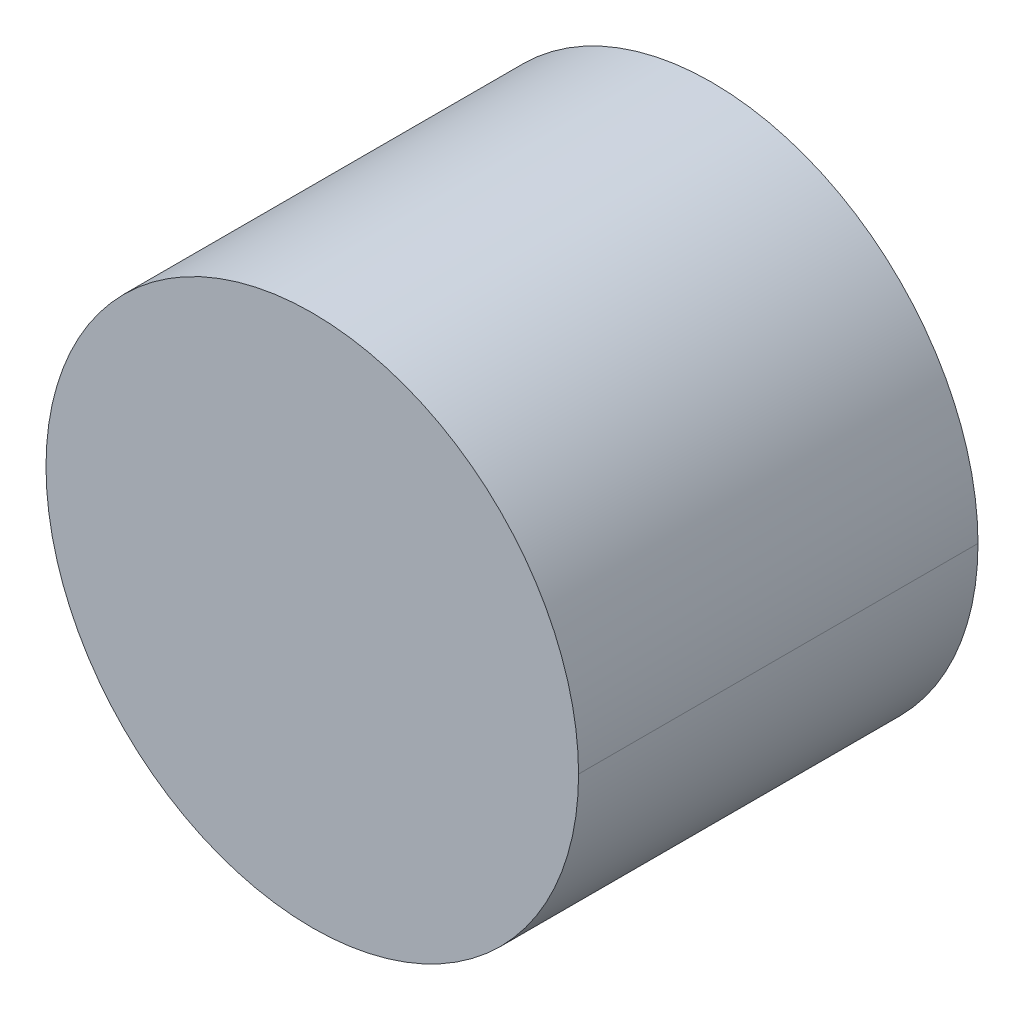
ISO-10303-21;
HEADER;
FILE_DESCRIPTION(('STEP AP214'),'2;1');
FILE_NAME('part.step','',(''),(''),'','','');
FILE_SCHEMA(('AUTOMOTIVE_DESIGN { 1 0 10303 214 1 1 1 1 }'));
ENDSEC;
DATA;
#1=APPLICATION_CONTEXT('core data for automotive mechanical design processes');
#2=APPLICATION_PROTOCOL_DEFINITION('international standard','automotive_design',2000,#1);
#3=PRODUCT_CONTEXT('',#1,'mechanical');
#4=PRODUCT('Part','Part','',(#3));
#5=PRODUCT_RELATED_PRODUCT_CATEGORY('part','',(#4));
#6=PRODUCT_DEFINITION_FORMATION('','',#4);
#7=PRODUCT_DEFINITION_CONTEXT('part definition',#1,'design');
#8=PRODUCT_DEFINITION('design','',#6,#7);
#9=PRODUCT_DEFINITION_SHAPE('','',#8);
#10=(LENGTH_UNIT() NAMED_UNIT(*) SI_UNIT(.MILLI.,.METRE.));
#11=(NAMED_UNIT(*) PLANE_ANGLE_UNIT() SI_UNIT($,.RADIAN.));
#12=(NAMED_UNIT(*) SI_UNIT($,.STERADIAN.) SOLID_ANGLE_UNIT());
#13=UNCERTAINTY_MEASURE_WITH_UNIT(LENGTH_MEASURE(1.E-05),#10,'distance_accuracy_value','');
#14=(GEOMETRIC_REPRESENTATION_CONTEXT(3) GLOBAL_UNCERTAINTY_ASSIGNED_CONTEXT((#13)) GLOBAL_UNIT_ASSIGNED_CONTEXT((#10,
#11,#12)) REPRESENTATION_CONTEXT('',''));
#15=CARTESIAN_POINT('',(0.,0.,0.));
#16=DIRECTION('',(0.,0.,1.));
#17=DIRECTION('',(1.,0.,0.));
#18=AXIS2_PLACEMENT_3D('',#15,#16,#17);
#19=CARTESIAN_POINT('',(0.,0.,16.9903914571));
#20=DIRECTION('',(0.,0.,-1.));
#21=DIRECTION('',(0.,-1.,0.));
#22=AXIS2_PLACEMENT_3D('',#19,#20,#21);
#23=PLANE('',#22);
#24=CARTESIAN_POINT('',(48.,0.,16.9903914571));
#25=DIRECTION('',(0.,0.,-1.));
#26=DIRECTION('',(1.,0.,0.));
#27=AXIS2_PLACEMENT_3D('',#24,#25,#26);
#28=CIRCLE('',#27,1.75);
#29=CARTESIAN_POINT('',(49.75,0.,16.9903914571));
#30=VERTEX_POINT('',#29);
#31=CARTESIAN_POINT('',(46.25,0.,16.9903914571));
#32=VERTEX_POINT('',#31);
#33=EDGE_CURVE('E27',#30,#32,#28,.T.);
#34=ORIENTED_EDGE('',*,*,#33,.T.);
#35=CARTESIAN_POINT('',(48.,0.,16.9903914571));
#36=DIRECTION('',(0.,0.,-1.));
#37=DIRECTION('',(1.,0.,0.));
#38=AXIS2_PLACEMENT_3D('',#35,#36,#37);
#39=CIRCLE('',#38,1.75);
#40=EDGE_CURVE('E11',#32,#30,#39,.T.);
#41=ORIENTED_EDGE('',*,*,#40,.T.);
#42=EDGE_LOOP('',(#34,#41));
#43=FACE_BOUND('',#42,.T.);
#44=ADVANCED_FACE('F16',(#43),#23,.T.);
#45=CARTESIAN_POINT('',(48.,0.,14.2403914571));
#46=DIRECTION('',(0.,0.,-1.));
#47=DIRECTION('',(1.,0.,0.));
#48=AXIS2_PLACEMENT_3D('',#45,#46,#47);
#49=CYLINDRICAL_SURFACE('',#48,1.75);
#50=DIRECTION('',(0.,0.,1.));
#51=VECTOR('',#50,1.);
#52=CARTESIAN_POINT('',(46.25,0.,14.2403914571));
#53=LINE('',#52,#51);
#54=CARTESIAN_POINT('',(46.25,0.,11.4903914571));
#55=VERTEX_POINT('',#54);
#56=EDGE_CURVE('E96',#55,#32,#53,.T.);
#57=ORIENTED_EDGE('',*,*,#56,.F.);
#58=CARTESIAN_POINT('',(48.,0.,11.4903914571));
#59=DIRECTION('',(0.,0.,-1.));
#60=DIRECTION('',(1.,0.,0.));
#61=AXIS2_PLACEMENT_3D('',#58,#59,#60);
#62=CIRCLE('',#61,1.75);
#63=CARTESIAN_POINT('',(49.75,0.,11.4903914571));
#64=VERTEX_POINT('',#63);
#65=EDGE_CURVE('E101',#55,#64,#62,.T.);
#66=ORIENTED_EDGE('',*,*,#65,.T.);
#67=DIRECTION('',(0.,0.,1.));
#68=VECTOR('',#67,1.);
#69=CARTESIAN_POINT('',(49.75,0.,14.2403914571));
#70=LINE('',#69,#68);
#71=EDGE_CURVE('E88',#64,#30,#70,.T.);
#72=ORIENTED_EDGE('',*,*,#71,.T.);
#73=ORIENTED_EDGE('',*,*,#40,.F.);
#74=EDGE_LOOP('',(#57,#66,#72,#73));
#75=FACE_BOUND('',#74,.T.);
#76=ADVANCED_FACE('F105',(#75),#49,.F.);
#77=CARTESIAN_POINT('',(48.,0.,14.2403914571));
#78=DIRECTION('',(0.,0.,-1.));
#79=DIRECTION('',(1.,0.,0.));
#80=AXIS2_PLACEMENT_3D('',#77,#78,#79);
#81=CYLINDRICAL_SURFACE('',#80,1.75);
#82=ORIENTED_EDGE('',*,*,#71,.F.);
#83=CARTESIAN_POINT('',(48.,0.,11.4903914571));
#84=DIRECTION('',(0.,0.,-1.));
#85=DIRECTION('',(1.,0.,0.));
#86=AXIS2_PLACEMENT_3D('',#83,#84,#85);
#87=CIRCLE('',#86,1.75);
#88=EDGE_CURVE('E92',#64,#55,#87,.T.);
#89=ORIENTED_EDGE('',*,*,#88,.T.);
#90=ORIENTED_EDGE('',*,*,#56,.T.);
#91=ORIENTED_EDGE('',*,*,#33,.F.);
#92=EDGE_LOOP('',(#82,#89,#90,#91));
#93=FACE_BOUND('',#92,.T.);
#94=ADVANCED_FACE('F90',(#93),#81,.F.);
#95=CARTESIAN_POINT('',(0.,0.,16.9903914571));
#96=DIRECTION('',(0.,0.,-1.));
#97=DIRECTION('',(0.,-1.,0.));
#98=AXIS2_PLACEMENT_3D('',#95,#96,#97);
#99=PLANE('',#98);
#100=CARTESIAN_POINT('',(-48.,0.,16.9903914571));
#101=DIRECTION('',(0.,0.,-1.));
#102=DIRECTION('',(1.,0.,0.));
#103=AXIS2_PLACEMENT_3D('',#100,#101,#102);
#104=CIRCLE('',#103,1.75);
#105=CARTESIAN_POINT('',(-49.75,0.,16.9903914571));
#106=VERTEX_POINT('',#105);
#107=CARTESIAN_POINT('',(-46.25,0.,16.9903914571));
#108=VERTEX_POINT('',#107);
#109=EDGE_CURVE('E122',#106,#108,#104,.T.);
#110=ORIENTED_EDGE('',*,*,#109,.T.);
#111=CARTESIAN_POINT('',(-48.,0.,16.9903914571));
#112=DIRECTION('',(0.,0.,-1.));
#113=DIRECTION('',(1.,0.,0.));
#114=AXIS2_PLACEMENT_3D('',#111,#112,#113);
#115=CIRCLE('',#114,1.75);
#116=EDGE_CURVE('E97',#108,#106,#115,.T.);
#117=ORIENTED_EDGE('',*,*,#116,.T.);
#118=EDGE_LOOP('',(#110,#117));
#119=FACE_BOUND('',#118,.T.);
#120=ADVANCED_FACE('F236',(#119),#99,.T.);
#121=CARTESIAN_POINT('',(-48.,0.,14.2403914571));
#122=DIRECTION('',(0.,0.,-1.));
#123=DIRECTION('',(-1.,0.,0.));
#124=AXIS2_PLACEMENT_3D('',#121,#122,#123);
#125=CYLINDRICAL_SURFACE('',#124,1.75);
#126=DIRECTION('',(0.,0.,1.));
#127=VECTOR('',#126,1.);
#128=CARTESIAN_POINT('',(-46.25,0.,14.2403914571));
#129=LINE('',#128,#127);
#130=CARTESIAN_POINT('',(-46.25,0.,11.4903914571));
#131=VERTEX_POINT('',#130);
#132=EDGE_CURVE('E119',#131,#108,#129,.T.);
#133=ORIENTED_EDGE('',*,*,#132,.F.);
#134=CARTESIAN_POINT('',(-48.,0.,11.4903914571));
#135=DIRECTION('',(0.,0.,-1.));
#136=DIRECTION('',(1.,0.,0.));
#137=AXIS2_PLACEMENT_3D('',#134,#135,#136);
#138=CIRCLE('',#137,1.75);
#139=CARTESIAN_POINT('',(-49.75,0.,11.4903914571));
#140=VERTEX_POINT('',#139);
#141=EDGE_CURVE('E103',#131,#140,#138,.T.);
#142=ORIENTED_EDGE('',*,*,#141,.T.);
#143=DIRECTION('',(0.,0.,1.));
#144=VECTOR('',#143,1.);
#145=CARTESIAN_POINT('',(-49.75,0.,14.2403914571));
#146=LINE('',#145,#144);
#147=EDGE_CURVE('E116',#140,#106,#146,.T.);
#148=ORIENTED_EDGE('',*,*,#147,.T.);
#149=ORIENTED_EDGE('',*,*,#116,.F.);
#150=EDGE_LOOP('',(#133,#142,#148,#149));
#151=FACE_BOUND('',#150,.T.);
#152=ADVANCED_FACE('F230',(#151),#125,.F.);
#153=CARTESIAN_POINT('',(-48.,0.,14.2403914571));
#154=DIRECTION('',(0.,0.,-1.));
#155=DIRECTION('',(-1.,0.,0.));
#156=AXIS2_PLACEMENT_3D('',#153,#154,#155);
#157=CYLINDRICAL_SURFACE('',#156,1.75);
#158=ORIENTED_EDGE('',*,*,#147,.F.);
#159=CARTESIAN_POINT('',(-48.,0.,11.4903914571));
#160=DIRECTION('',(0.,0.,-1.));
#161=DIRECTION('',(1.,0.,0.));
#162=AXIS2_PLACEMENT_3D('',#159,#160,#161);
#163=CIRCLE('',#162,1.75);
#164=EDGE_CURVE('E120',#140,#131,#163,.T.);
#165=ORIENTED_EDGE('',*,*,#164,.T.);
#166=ORIENTED_EDGE('',*,*,#132,.T.);
#167=ORIENTED_EDGE('',*,*,#109,.F.);
#168=EDGE_LOOP('',(#158,#165,#166,#167));
#169=FACE_BOUND('',#168,.T.);
#170=ADVANCED_FACE('F225',(#169),#157,.F.);
#171=CARTESIAN_POINT('',(0.,0.,11.4903914571));
#172=DIRECTION('',(0.,0.,1.));
#173=DIRECTION('',(1.,0.,0.));
#174=AXIS2_PLACEMENT_3D('',#171,#172,#173);
#175=PLANE('',#174);
#176=ORIENTED_EDGE('',*,*,#141,.F.);
#177=ORIENTED_EDGE('',*,*,#164,.F.);
#178=EDGE_LOOP('',(#176,#177));
#179=FACE_BOUND('',#178,.T.);
#180=ORIENTED_EDGE('',*,*,#65,.F.);
#181=ORIENTED_EDGE('',*,*,#88,.F.);
#182=EDGE_LOOP('',(#180,#181));
#183=FACE_BOUND('',#182,.T.);
#184=CARTESIAN_POINT('',(0.,0.,11.4903914571));
#185=DIRECTION('',(0.,0.,1.));
#186=DIRECTION('',(1.,0.,0.));
#187=AXIS2_PLACEMENT_3D('',#184,#185,#186);
#188=CIRCLE('',#187,4.188);
#189=CARTESIAN_POINT('',(-3.6753157692,-2.00783415567,11.4903914571));
#190=VERTEX_POINT('',#189);
#191=CARTESIAN_POINT('',(3.6753157692,2.00783415567,11.4903914571));
#192=VERTEX_POINT('',#191);
#193=EDGE_CURVE('E151',#190,#192,#188,.T.);
#194=ORIENTED_EDGE('',*,*,#193,.T.);
#195=CARTESIAN_POINT('',(0.,0.,11.4903914571));
#196=DIRECTION('',(0.,0.,1.));
#197=DIRECTION('',(1.,0.,0.));
#198=AXIS2_PLACEMENT_3D('',#195,#196,#197);
#199=CIRCLE('',#198,4.188);
#200=EDGE_CURVE('E20',#192,#190,#199,.T.);
#201=ORIENTED_EDGE('',*,*,#200,.T.);
#202=EDGE_LOOP('',(#194,#201));
#203=FACE_BOUND('',#202,.T.);
#204=CARTESIAN_POINT('',(0.,0.,11.4903914571));
#205=DIRECTION('',(0.,0.,1.));
#206=DIRECTION('',(1.,0.,0.));
#207=AXIS2_PLACEMENT_3D('',#204,#205,#206);
#208=CIRCLE('',#207,54.);
#209=CARTESIAN_POINT('',(-54.,0.,11.4903914571));
#210=VERTEX_POINT('',#209);
#211=CARTESIAN_POINT('',(54.,0.,11.4903914571));
#212=VERTEX_POINT('',#211);
#213=EDGE_CURVE('E156',#210,#212,#208,.T.);
#214=ORIENTED_EDGE('',*,*,#213,.F.);
#215=CARTESIAN_POINT('',(0.,0.,11.4903914571));
#216=DIRECTION('',(0.,0.,1.));
#217=DIRECTION('',(1.,0.,0.));
#218=AXIS2_PLACEMENT_3D('',#215,#216,#217);
#219=CIRCLE('',#218,54.);
#220=EDGE_CURVE('E114',#212,#210,#219,.T.);
#221=ORIENTED_EDGE('',*,*,#220,.F.);
#222=EDGE_LOOP('',(#214,#221));
#223=FACE_BOUND('',#222,.T.);
#224=ADVANCED_FACE('F18',(#179,#183,#203,#223),#175,.F.);
#225=CARTESIAN_POINT('',(0.,0.,11.4903914571));
#226=DIRECTION('',(0.,0.,1.));
#227=DIRECTION('',(0.877582561890373,0.479425538604204,0.));
#228=AXIS2_PLACEMENT_3D('',#225,#226,#227);
#229=CYLINDRICAL_SURFACE('',#228,4.188);
#230=ORIENTED_EDGE('',*,*,#200,.F.);
#231=DIRECTION('',(0.,0.,-1.));
#232=VECTOR('',#231,1.);
#233=CARTESIAN_POINT('',(3.6753157692,2.00783415567,16.3353914566));
#234=LINE('',#233,#232);
#235=CARTESIAN_POINT('',(3.6753157692,2.00783415567,21.4903914571));
#236=VERTEX_POINT('',#235);
#237=EDGE_CURVE('E111',#236,#192,#234,.T.);
#238=ORIENTED_EDGE('',*,*,#237,.F.);
#239=CARTESIAN_POINT('',(0.,0.,21.4903914571));
#240=DIRECTION('',(0.,0.,1.));
#241=DIRECTION('',(1.,0.,0.));
#242=AXIS2_PLACEMENT_3D('',#239,#240,#241);
#243=CIRCLE('',#242,4.188);
#244=CARTESIAN_POINT('',(-3.6753157692,-2.00783415567,21.4903914571));
#245=VERTEX_POINT('',#244);
#246=EDGE_CURVE('E142',#236,#245,#243,.T.);
#247=ORIENTED_EDGE('',*,*,#246,.T.);
#248=DIRECTION('',(0.,0.,-1.));
#249=VECTOR('',#248,1.);
#250=CARTESIAN_POINT('',(-3.6753157692,-2.00783415567,16.3353914566));
#251=LINE('',#250,#249);
#252=EDGE_CURVE('E155',#245,#190,#251,.T.);
#253=ORIENTED_EDGE('',*,*,#252,.T.);
#254=EDGE_LOOP('',(#230,#238,#247,#253));
#255=FACE_BOUND('',#254,.T.);
#256=ADVANCED_FACE('F189',(#255),#229,.F.);
#257=CARTESIAN_POINT('',(0.,0.,11.4903914571));
#258=DIRECTION('',(0.,0.,1.));
#259=DIRECTION('',(0.877582561890373,0.479425538604204,0.));
#260=AXIS2_PLACEMENT_3D('',#257,#258,#259);
#261=CYLINDRICAL_SURFACE('',#260,4.188);
#262=ORIENTED_EDGE('',*,*,#193,.F.);
#263=ORIENTED_EDGE('',*,*,#252,.F.);
#264=CARTESIAN_POINT('',(0.,0.,21.4903914571));
#265=DIRECTION('',(0.,0.,1.));
#266=DIRECTION('',(1.,0.,0.));
#267=AXIS2_PLACEMENT_3D('',#264,#265,#266);
#268=CIRCLE('',#267,4.188);
#269=EDGE_CURVE('E145',#245,#236,#268,.T.);
#270=ORIENTED_EDGE('',*,*,#269,.T.);
#271=ORIENTED_EDGE('',*,*,#237,.T.);
#272=EDGE_LOOP('',(#262,#263,#270,#271));
#273=FACE_BOUND('',#272,.T.);
#274=ADVANCED_FACE('F184',(#273),#261,.F.);
#275=CARTESIAN_POINT('',(0.,0.,51.9903914571));
#276=DIRECTION('',(0.,0.,1.));
#277=DIRECTION('',(1.,0.,0.));
#278=AXIS2_PLACEMENT_3D('',#275,#276,#277);
#279=CYLINDRICAL_SURFACE('',#278,54.);
#280=DIRECTION('',(0.,0.,1.));
#281=VECTOR('',#280,1.);
#282=CARTESIAN_POINT('',(54.,0.,51.9903914571));
#283=LINE('',#282,#281);
#284=CARTESIAN_POINT('',(54.,0.,92.4903914571));
#285=VERTEX_POINT('',#284);
#286=EDGE_CURVE('E160',#212,#285,#283,.T.);
#287=ORIENTED_EDGE('',*,*,#286,.F.);
#288=ORIENTED_EDGE('',*,*,#220,.T.);
#289=DIRECTION('',(0.,0.,1.));
#290=VECTOR('',#289,1.);
#291=CARTESIAN_POINT('',(-54.,0.,51.9903914571));
#292=LINE('',#291,#290);
#293=CARTESIAN_POINT('',(-54.,0.,92.4903914571));
#294=VERTEX_POINT('',#293);
#295=EDGE_CURVE('E161',#210,#294,#292,.T.);
#296=ORIENTED_EDGE('',*,*,#295,.T.);
#297=CARTESIAN_POINT('',(0.,0.,92.4903914571));
#298=DIRECTION('',(0.,0.,1.));
#299=DIRECTION('',(1.,0.,0.));
#300=AXIS2_PLACEMENT_3D('',#297,#298,#299);
#301=CIRCLE('',#300,54.);
#302=EDGE_CURVE('E137',#285,#294,#301,.T.);
#303=ORIENTED_EDGE('',*,*,#302,.F.);
#304=EDGE_LOOP('',(#287,#288,#296,#303));
#305=FACE_BOUND('',#304,.T.);
#306=ADVANCED_FACE('F214',(#305),#279,.T.);
#307=CARTESIAN_POINT('',(0.,0.,51.9903914571));
#308=DIRECTION('',(0.,0.,1.));
#309=DIRECTION('',(1.,0.,0.));
#310=AXIS2_PLACEMENT_3D('',#307,#308,#309);
#311=CYLINDRICAL_SURFACE('',#310,54.);
#312=ORIENTED_EDGE('',*,*,#295,.F.);
#313=ORIENTED_EDGE('',*,*,#213,.T.);
#314=ORIENTED_EDGE('',*,*,#286,.T.);
#315=CARTESIAN_POINT('',(0.,0.,92.4903914571));
#316=DIRECTION('',(0.,0.,1.));
#317=DIRECTION('',(1.,0.,0.));
#318=AXIS2_PLACEMENT_3D('',#315,#316,#317);
#319=CIRCLE('',#318,54.);
#320=EDGE_CURVE('E141',#294,#285,#319,.T.);
#321=ORIENTED_EDGE('',*,*,#320,.F.);
#322=EDGE_LOOP('',(#312,#313,#314,#321));
#323=FACE_BOUND('',#322,.T.);
#324=ADVANCED_FACE('F199',(#323),#311,.T.);
#325=CARTESIAN_POINT('',(0.,0.,92.4903914571));
#326=DIRECTION('',(0.,0.,1.));
#327=DIRECTION('',(1.,0.,0.));
#328=AXIS2_PLACEMENT_3D('',#325,#326,#327);
#329=PLANE('',#328);
#330=ORIENTED_EDGE('',*,*,#302,.T.);
#331=ORIENTED_EDGE('',*,*,#320,.T.);
#332=EDGE_LOOP('',(#330,#331));
#333=FACE_BOUND('',#332,.T.);
#334=ADVANCED_FACE('F193',(#333),#329,.T.);
#335=CARTESIAN_POINT('',(0.,0.,21.4903914571));
#336=DIRECTION('',(0.,0.,1.));
#337=DIRECTION('',(1.,0.,0.));
#338=AXIS2_PLACEMENT_3D('',#335,#336,#337);
#339=PLANE('',#338);
#340=ORIENTED_EDGE('',*,*,#269,.F.);
#341=ORIENTED_EDGE('',*,*,#246,.F.);
#342=EDGE_LOOP('',(#340,#341));
#343=FACE_BOUND('',#342,.T.);
#344=ADVANCED_FACE('F191',(#343),#339,.F.);
#345=CLOSED_SHELL('',(#44,#76,#94,#120,#152,#170,#224,#256,#274,#306,#324,#334,#344));
#346=MANIFOLD_SOLID_BREP('B1',#345);
#347=ADVANCED_BREP_SHAPE_REPRESENTATION('',(#18,#346),#14);
#348=SHAPE_DEFINITION_REPRESENTATION(#9,#347);
ENDSEC;
END-ISO-10303-21;
